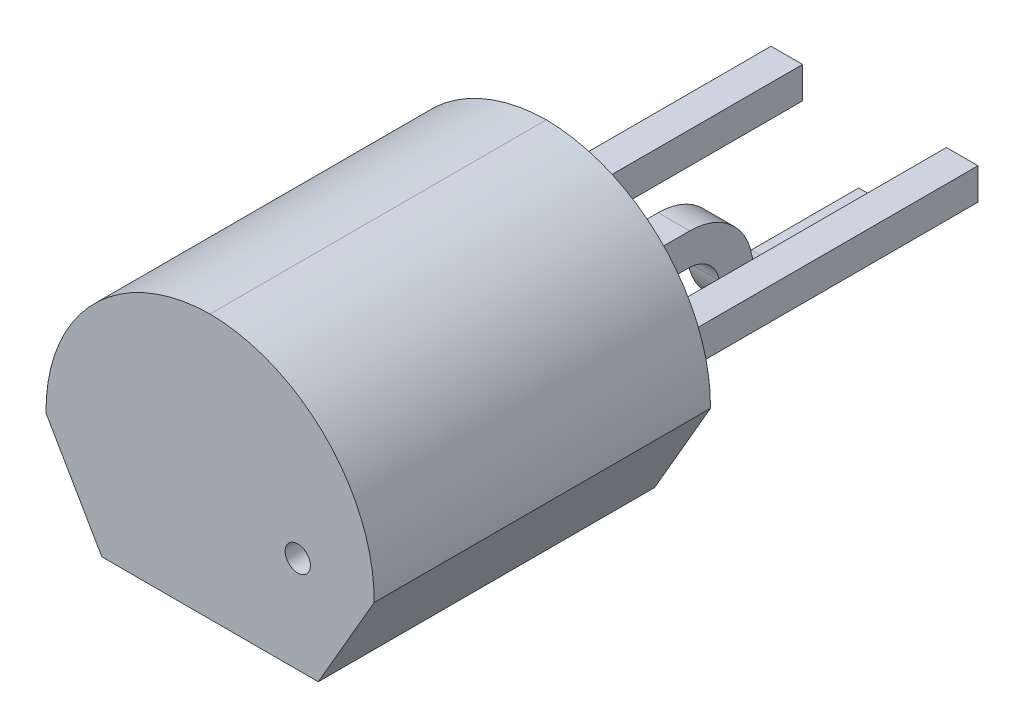
ISO-10303-21;
HEADER;
FILE_DESCRIPTION(('STEP AP214'),'2;1');
FILE_NAME('part.step','',(''),(''),'','','');
FILE_SCHEMA(('AUTOMOTIVE_DESIGN { 1 0 10303 214 1 1 1 1 }'));
ENDSEC;
DATA;
#1=APPLICATION_CONTEXT('core data for automotive mechanical design processes');
#2=APPLICATION_PROTOCOL_DEFINITION('international standard','automotive_design',2000,#1);
#3=PRODUCT_CONTEXT('',#1,'mechanical');
#4=PRODUCT('Part','Part','',(#3));
#5=PRODUCT_RELATED_PRODUCT_CATEGORY('part','',(#4));
#6=PRODUCT_DEFINITION_FORMATION('','',#4);
#7=PRODUCT_DEFINITION_CONTEXT('part definition',#1,'design');
#8=PRODUCT_DEFINITION('design','',#6,#7);
#9=PRODUCT_DEFINITION_SHAPE('','',#8);
#10=(LENGTH_UNIT() NAMED_UNIT(*) SI_UNIT(.MILLI.,.METRE.));
#11=(NAMED_UNIT(*) PLANE_ANGLE_UNIT() SI_UNIT($,.RADIAN.));
#12=(NAMED_UNIT(*) SI_UNIT($,.STERADIAN.) SOLID_ANGLE_UNIT());
#13=UNCERTAINTY_MEASURE_WITH_UNIT(LENGTH_MEASURE(1.E-05),#10,'distance_accuracy_value','');
#14=(GEOMETRIC_REPRESENTATION_CONTEXT(3) GLOBAL_UNCERTAINTY_ASSIGNED_CONTEXT((#13)) GLOBAL_UNIT_ASSIGNED_CONTEXT((#10,
#11,#12)) REPRESENTATION_CONTEXT('',''));
#15=CARTESIAN_POINT('',(0.,0.,0.));
#16=DIRECTION('',(0.,0.,1.));
#17=DIRECTION('',(1.,0.,0.));
#18=AXIS2_PLACEMENT_3D('',#15,#16,#17);
#19=CARTESIAN_POINT('',(2.53,0.25,2.54));
#20=DIRECTION('',(1.,0.,0.));
#21=DIRECTION('',(0.,0.,-1.));
#22=AXIS2_PLACEMENT_3D('',#19,#20,#21);
#23=PLANE('',#22);
#24=DIRECTION('',(0.,1.,0.));
#25=VECTOR('',#24,1.);
#26=CARTESIAN_POINT('',(2.53,-0.25,-2.66));
#27=LINE('',#26,#25);
#28=CARTESIAN_POINT('',(2.53,-0.25,-2.66));
#29=VERTEX_POINT('',#28);
#30=CARTESIAN_POINT('',(2.53,0.25,-2.66));
#31=VERTEX_POINT('',#30);
#32=EDGE_CURVE('E46',#29,#31,#27,.T.);
#33=ORIENTED_EDGE('',*,*,#32,.F.);
#34=DIRECTION('',(0.,0.,-1.));
#35=VECTOR('',#34,1.);
#36=CARTESIAN_POINT('',(2.53,-0.25,2.54));
#37=LINE('',#36,#35);
#38=CARTESIAN_POINT('',(2.53,-0.25,2.54));
#39=VERTEX_POINT('',#38);
#40=EDGE_CURVE('E196',#39,#29,#37,.T.);
#41=ORIENTED_EDGE('',*,*,#40,.F.);
#42=DIRECTION('',(0.,-1.,0.));
#43=VECTOR('',#42,1.);
#44=CARTESIAN_POINT('',(2.53,0.25,2.54));
#45=LINE('',#44,#43);
#46=CARTESIAN_POINT('',(2.53,0.25,2.54));
#47=VERTEX_POINT('',#46);
#48=EDGE_CURVE('E381',#47,#39,#45,.T.);
#49=ORIENTED_EDGE('',*,*,#48,.F.);
#50=DIRECTION('',(0.,0.,-1.));
#51=VECTOR('',#50,1.);
#52=CARTESIAN_POINT('',(2.53,0.25,2.54));
#53=LINE('',#52,#51);
#54=EDGE_CURVE('E199',#47,#31,#53,.T.);
#55=ORIENTED_EDGE('',*,*,#54,.T.);
#56=EDGE_LOOP('',(#33,#41,#49,#55));
#57=FACE_BOUND('',#56,.T.);
#58=ADVANCED_FACE('F31',(#57),#23,.F.);
#59=CARTESIAN_POINT('',(2.53,-0.25,2.54));
#60=DIRECTION('',(0.,1.,0.));
#61=DIRECTION('',(-1.,0.,0.));
#62=AXIS2_PLACEMENT_3D('',#59,#60,#61);
#63=PLANE('',#62);
#64=DIRECTION('',(-1.,0.,0.));
#65=VECTOR('',#64,1.);
#66=CARTESIAN_POINT('',(3.03,-0.25,-2.66));
#67=LINE('',#66,#65);
#68=CARTESIAN_POINT('',(3.03,-0.25,-2.66));
#69=VERTEX_POINT('',#68);
#70=EDGE_CURVE('E184',#69,#29,#67,.T.);
#71=ORIENTED_EDGE('',*,*,#70,.F.);
#72=DIRECTION('',(0.,0.,-1.));
#73=VECTOR('',#72,1.);
#74=CARTESIAN_POINT('',(3.03,-0.25,2.54));
#75=LINE('',#74,#73);
#76=CARTESIAN_POINT('',(3.03,-0.25,2.54));
#77=VERTEX_POINT('',#76);
#78=EDGE_CURVE('E206',#77,#69,#75,.T.);
#79=ORIENTED_EDGE('',*,*,#78,.F.);
#80=DIRECTION('',(1.,0.,0.));
#81=VECTOR('',#80,1.);
#82=CARTESIAN_POINT('',(2.53,-0.25,2.54));
#83=LINE('',#82,#81);
#84=EDGE_CURVE('E204',#39,#77,#83,.T.);
#85=ORIENTED_EDGE('',*,*,#84,.F.);
#86=ORIENTED_EDGE('',*,*,#40,.T.);
#87=EDGE_LOOP('',(#71,#79,#85,#86));
#88=FACE_BOUND('',#87,.T.);
#89=ADVANCED_FACE('F202',(#88),#63,.F.);
#90=CARTESIAN_POINT('',(3.03,0.25,2.54));
#91=DIRECTION('',(-1.,0.,0.));
#92=DIRECTION('',(0.,-1.,0.));
#93=AXIS2_PLACEMENT_3D('',#90,#91,#92);
#94=PLANE('',#93);
#95=DIRECTION('',(0.,-1.,0.));
#96=VECTOR('',#95,1.);
#97=CARTESIAN_POINT('',(3.03,0.25,-2.66));
#98=LINE('',#97,#96);
#99=CARTESIAN_POINT('',(3.03,0.25,-2.66));
#100=VERTEX_POINT('',#99);
#101=EDGE_CURVE('E187',#100,#69,#98,.T.);
#102=ORIENTED_EDGE('',*,*,#101,.F.);
#103=DIRECTION('',(0.,0.,-1.));
#104=VECTOR('',#103,1.);
#105=CARTESIAN_POINT('',(3.03,0.25,2.54));
#106=LINE('',#105,#104);
#107=CARTESIAN_POINT('',(3.03,0.25,2.54));
#108=VERTEX_POINT('',#107);
#109=EDGE_CURVE('E211',#108,#100,#106,.T.);
#110=ORIENTED_EDGE('',*,*,#109,.F.);
#111=DIRECTION('',(0.,1.,0.));
#112=VECTOR('',#111,1.);
#113=CARTESIAN_POINT('',(3.03,0.25,2.54));
#114=LINE('',#113,#112);
#115=EDGE_CURVE('E386',#77,#108,#114,.T.);
#116=ORIENTED_EDGE('',*,*,#115,.F.);
#117=ORIENTED_EDGE('',*,*,#78,.T.);
#118=EDGE_LOOP('',(#102,#110,#116,#117));
#119=FACE_BOUND('',#118,.T.);
#120=ADVANCED_FACE('F398',(#119),#94,.F.);
#121=CARTESIAN_POINT('',(2.53,0.25,2.54));
#122=DIRECTION('',(0.,-1.,0.));
#123=DIRECTION('',(1.,0.,0.));
#124=AXIS2_PLACEMENT_3D('',#121,#122,#123);
#125=PLANE('',#124);
#126=DIRECTION('',(1.,0.,0.));
#127=VECTOR('',#126,1.);
#128=CARTESIAN_POINT('',(2.53,0.25,-2.66));
#129=LINE('',#128,#127);
#130=EDGE_CURVE('E200',#31,#100,#129,.T.);
#131=ORIENTED_EDGE('',*,*,#130,.F.);
#132=ORIENTED_EDGE('',*,*,#54,.F.);
#133=DIRECTION('',(-1.,0.,0.));
#134=VECTOR('',#133,1.);
#135=CARTESIAN_POINT('',(2.53,0.25,2.54));
#136=LINE('',#135,#134);
#137=EDGE_CURVE('E389',#108,#47,#136,.T.);
#138=ORIENTED_EDGE('',*,*,#137,.F.);
#139=ORIENTED_EDGE('',*,*,#109,.T.);
#140=EDGE_LOOP('',(#131,#132,#138,#139));
#141=FACE_BOUND('',#140,.T.);
#142=ADVANCED_FACE('F395',(#141),#125,.F.);
#143=CARTESIAN_POINT('',(-0.25,0.25,2.54));
#144=DIRECTION('',(1.,0.,0.));
#145=DIRECTION('',(0.,1.,0.));
#146=AXIS2_PLACEMENT_3D('',#143,#144,#145);
#147=PLANE('',#146);
#148=DIRECTION('',(0.,1.,0.));
#149=VECTOR('',#148,1.);
#150=CARTESIAN_POINT('',(-0.25,-0.25,-2.66));
#151=LINE('',#150,#149);
#152=CARTESIAN_POINT('',(-0.25,-0.25,-2.66));
#153=VERTEX_POINT('',#152);
#154=CARTESIAN_POINT('',(-0.25,0.25,-2.66));
#155=VERTEX_POINT('',#154);
#156=EDGE_CURVE('E54',#153,#155,#151,.T.);
#157=ORIENTED_EDGE('',*,*,#156,.F.);
#158=DIRECTION('',(0.,0.,-1.));
#159=VECTOR('',#158,1.);
#160=CARTESIAN_POINT('',(-0.25,-0.25,2.54));
#161=LINE('',#160,#159);
#162=CARTESIAN_POINT('',(-0.25,-0.25,2.54));
#163=VERTEX_POINT('',#162);
#164=EDGE_CURVE('E256',#163,#153,#161,.T.);
#165=ORIENTED_EDGE('',*,*,#164,.F.);
#166=DIRECTION('',(0.,-1.,0.));
#167=VECTOR('',#166,1.);
#168=CARTESIAN_POINT('',(-0.25,0.25,2.54));
#169=LINE('',#168,#167);
#170=CARTESIAN_POINT('',(-0.25,0.25,2.54));
#171=VERTEX_POINT('',#170);
#172=EDGE_CURVE('E235',#171,#163,#169,.T.);
#173=ORIENTED_EDGE('',*,*,#172,.F.);
#174=DIRECTION('',(0.,0.,-1.));
#175=VECTOR('',#174,1.);
#176=CARTESIAN_POINT('',(-0.25,0.25,2.54));
#177=LINE('',#176,#175);
#178=EDGE_CURVE('E247',#171,#155,#177,.T.);
#179=ORIENTED_EDGE('',*,*,#178,.T.);
#180=EDGE_LOOP('',(#157,#165,#173,#179));
#181=FACE_BOUND('',#180,.T.);
#182=ADVANCED_FACE('F459',(#181),#147,.F.);
#183=CARTESIAN_POINT('',(-0.25,-0.25,2.54));
#184=DIRECTION('',(0.,1.,0.));
#185=DIRECTION('',(0.,0.,1.));
#186=AXIS2_PLACEMENT_3D('',#183,#184,#185);
#187=PLANE('',#186);
#188=DIRECTION('',(-1.,0.,0.));
#189=VECTOR('',#188,1.);
#190=CARTESIAN_POINT('',(0.25,-0.25,-2.66));
#191=LINE('',#190,#189);
#192=CARTESIAN_POINT('',(0.25,-0.25,-2.66));
#193=VERTEX_POINT('',#192);
#194=EDGE_CURVE('E399',#193,#153,#191,.T.);
#195=ORIENTED_EDGE('',*,*,#194,.F.);
#196=DIRECTION('',(0.,0.,-1.));
#197=VECTOR('',#196,1.);
#198=CARTESIAN_POINT('',(0.25,-0.25,2.54));
#199=LINE('',#198,#197);
#200=CARTESIAN_POINT('',(0.25,-0.25,2.54));
#201=VERTEX_POINT('',#200);
#202=EDGE_CURVE('E253',#201,#193,#199,.T.);
#203=ORIENTED_EDGE('',*,*,#202,.F.);
#204=DIRECTION('',(1.,0.,0.));
#205=VECTOR('',#204,1.);
#206=CARTESIAN_POINT('',(-0.25,-0.25,2.54));
#207=LINE('',#206,#205);
#208=EDGE_CURVE('E238',#163,#201,#207,.T.);
#209=ORIENTED_EDGE('',*,*,#208,.F.);
#210=ORIENTED_EDGE('',*,*,#164,.T.);
#211=EDGE_LOOP('',(#195,#203,#209,#210));
#212=FACE_BOUND('',#211,.T.);
#213=ADVANCED_FACE('F455',(#212),#187,.F.);
#214=CARTESIAN_POINT('',(0.25,0.25,2.54));
#215=DIRECTION('',(-1.,0.,0.));
#216=DIRECTION('',(0.,-1.,0.));
#217=AXIS2_PLACEMENT_3D('',#214,#215,#216);
#218=PLANE('',#217);
#219=DIRECTION('',(0.,-1.,0.));
#220=VECTOR('',#219,1.);
#221=CARTESIAN_POINT('',(0.25,0.25,-2.66));
#222=LINE('',#221,#220);
#223=CARTESIAN_POINT('',(0.25,0.25,-2.66));
#224=VERTEX_POINT('',#223);
#225=EDGE_CURVE('E407',#224,#193,#222,.T.);
#226=ORIENTED_EDGE('',*,*,#225,.F.);
#227=DIRECTION('',(0.,0.,-1.));
#228=VECTOR('',#227,1.);
#229=CARTESIAN_POINT('',(0.25,0.25,2.54));
#230=LINE('',#229,#228);
#231=CARTESIAN_POINT('',(0.25,0.25,2.54));
#232=VERTEX_POINT('',#231);
#233=EDGE_CURVE('E250',#232,#224,#230,.T.);
#234=ORIENTED_EDGE('',*,*,#233,.F.);
#235=DIRECTION('',(0.,1.,0.));
#236=VECTOR('',#235,1.);
#237=CARTESIAN_POINT('',(0.25,0.25,2.54));
#238=LINE('',#237,#236);
#239=EDGE_CURVE('E241',#201,#232,#238,.T.);
#240=ORIENTED_EDGE('',*,*,#239,.F.);
#241=ORIENTED_EDGE('',*,*,#202,.T.);
#242=EDGE_LOOP('',(#226,#234,#240,#241));
#243=FACE_BOUND('',#242,.T.);
#244=ADVANCED_FACE('F451',(#243),#218,.F.);
#245=CARTESIAN_POINT('',(-0.25,0.25,2.54));
#246=DIRECTION('',(0.,-1.,0.));
#247=DIRECTION('',(0.,0.,-1.));
#248=AXIS2_PLACEMENT_3D('',#245,#246,#247);
#249=PLANE('',#248);
#250=DIRECTION('',(1.,0.,0.));
#251=VECTOR('',#250,1.);
#252=CARTESIAN_POINT('',(-0.25,0.25,-2.66));
#253=LINE('',#252,#251);
#254=EDGE_CURVE('E405',#155,#224,#253,.T.);
#255=ORIENTED_EDGE('',*,*,#254,.F.);
#256=ORIENTED_EDGE('',*,*,#178,.F.);
#257=DIRECTION('',(-1.,0.,0.));
#258=VECTOR('',#257,1.);
#259=CARTESIAN_POINT('',(-0.25,0.25,2.54));
#260=LINE('',#259,#258);
#261=EDGE_CURVE('E244',#232,#171,#260,.T.);
#262=ORIENTED_EDGE('',*,*,#261,.F.);
#263=ORIENTED_EDGE('',*,*,#233,.T.);
#264=EDGE_LOOP('',(#255,#256,#262,#263));
#265=FACE_BOUND('',#264,.T.);
#266=ADVANCED_FACE('F448',(#265),#249,.F.);
#267=CARTESIAN_POINT('',(1.14,0.25,2.54));
#268=DIRECTION('',(1.,0.,0.));
#269=DIRECTION('',(0.,0.,-1.));
#270=AXIS2_PLACEMENT_3D('',#267,#268,#269);
#271=PLANE('',#270);
#272=DIRECTION('',(0.,1.,0.));
#273=VECTOR('',#272,1.);
#274=CARTESIAN_POINT('',(1.14,-1.5,-2.66));
#275=LINE('',#274,#273);
#276=CARTESIAN_POINT('',(1.14,-1.5,-2.66));
#277=VERTEX_POINT('',#276);
#278=CARTESIAN_POINT('',(1.14,-1.,-2.66));
#279=VERTEX_POINT('',#278);
#280=EDGE_CURVE('E411',#277,#279,#275,.T.);
#281=ORIENTED_EDGE('',*,*,#280,.F.);
#282=DIRECTION('',(0.,0.,1.));
#283=VECTOR('',#282,1.);
#284=CARTESIAN_POINT('',(1.14,-1.5,-10.16));
#285=LINE('',#284,#283);
#286=CARTESIAN_POINT('',(1.14,-1.5,-0.939019945774904));
#287=VERTEX_POINT('',#286);
#288=EDGE_CURVE('E356',#277,#287,#285,.T.);
#289=ORIENTED_EDGE('',*,*,#288,.T.);
#290=CARTESIAN_POINT('',(1.14,-0.5,-0.939019945774904));
#291=DIRECTION('',(1.,0.,0.));
#292=DIRECTION('',(0.,0.,-1.));
#293=AXIS2_PLACEMENT_3D('',#290,#291,#292);
#294=CIRCLE('',#293,1.);
#295=CARTESIAN_POINT('',(1.14,-0.666666666666667,0.0469933514083655));
#296=VERTEX_POINT('',#295);
#297=EDGE_CURVE('E307',#287,#296,#294,.F.);
#298=ORIENTED_EDGE('',*,*,#297,.T.);
#299=CARTESIAN_POINT('',(1.14,-0.75,0.54));
#300=DIRECTION('',(1.,0.,0.));
#301=DIRECTION('',(0.,0.,-1.));
#302=AXIS2_PLACEMENT_3D('',#299,#300,#301);
#303=CIRCLE('',#302,0.5);
#304=CARTESIAN_POINT('',(1.14,-0.25,0.54));
#305=VERTEX_POINT('',#304);
#306=EDGE_CURVE('E302',#296,#305,#303,.T.);
#307=ORIENTED_EDGE('',*,*,#306,.T.);
#308=DIRECTION('',(0.,0.,-1.));
#309=VECTOR('',#308,1.);
#310=CARTESIAN_POINT('',(1.14,-0.25,2.54));
#311=LINE('',#310,#309);
#312=CARTESIAN_POINT('',(1.14,-0.25,2.54));
#313=VERTEX_POINT('',#312);
#314=EDGE_CURVE('E232',#313,#305,#311,.T.);
#315=ORIENTED_EDGE('',*,*,#314,.F.);
#316=DIRECTION('',(0.,-1.,0.));
#317=VECTOR('',#316,1.);
#318=CARTESIAN_POINT('',(1.14,0.25,2.54));
#319=LINE('',#318,#317);
#320=CARTESIAN_POINT('',(1.14,0.25,2.54));
#321=VERTEX_POINT('',#320);
#322=EDGE_CURVE('E205',#321,#313,#319,.T.);
#323=ORIENTED_EDGE('',*,*,#322,.F.);
#324=DIRECTION('',(0.,0.,-1.));
#325=VECTOR('',#324,1.);
#326=CARTESIAN_POINT('',(1.14,0.25,2.54));
#327=LINE('',#326,#325);
#328=CARTESIAN_POINT('',(1.14,0.25,0.519019945774905));
#329=VERTEX_POINT('',#328);
#330=EDGE_CURVE('E223',#321,#329,#327,.T.);
#331=ORIENTED_EDGE('',*,*,#330,.T.);
#332=CARTESIAN_POINT('',(1.14,-0.75,0.519019945774905));
#333=DIRECTION('',(1.,0.,0.));
#334=DIRECTION('',(0.,0.,-1.));
#335=AXIS2_PLACEMENT_3D('',#332,#333,#334);
#336=CIRCLE('',#335,1.);
#337=CARTESIAN_POINT('',(1.14,-0.583333333333333,-0.466993351408365));
#338=VERTEX_POINT('',#337);
#339=EDGE_CURVE('E309',#329,#338,#336,.F.);
#340=ORIENTED_EDGE('',*,*,#339,.T.);
#341=CARTESIAN_POINT('',(1.14,-0.5,-0.96));
#342=DIRECTION('',(1.,0.,0.));
#343=DIRECTION('',(0.,0.,-1.));
#344=AXIS2_PLACEMENT_3D('',#341,#342,#343);
#345=CIRCLE('',#344,0.5);
#346=CARTESIAN_POINT('',(1.14,-1.,-0.96));
#347=VERTEX_POINT('',#346);
#348=EDGE_CURVE('E346',#338,#347,#345,.T.);
#349=ORIENTED_EDGE('',*,*,#348,.T.);
#350=DIRECTION('',(0.,0.,-1.));
#351=VECTOR('',#350,1.);
#352=CARTESIAN_POINT('',(1.14,-1.,2.54));
#353=LINE('',#352,#351);
#354=EDGE_CURVE('E357',#347,#279,#353,.T.);
#355=ORIENTED_EDGE('',*,*,#354,.T.);
#356=EDGE_LOOP('',(#281,#289,#298,#307,#315,#323,#331,#340,#349,#355));
#357=FACE_BOUND('',#356,.T.);
#358=ADVANCED_FACE('F335',(#357),#271,.F.);
#359=CARTESIAN_POINT('',(1.64,0.25,2.54));
#360=DIRECTION('',(-1.,0.,0.));
#361=DIRECTION('',(0.,0.,1.));
#362=AXIS2_PLACEMENT_3D('',#359,#360,#361);
#363=PLANE('',#362);
#364=DIRECTION('',(0.,-1.,0.));
#365=VECTOR('',#364,1.);
#366=CARTESIAN_POINT('',(1.64,-1.,-2.66));
#367=LINE('',#366,#365);
#368=CARTESIAN_POINT('',(1.64,-1.,-2.66));
#369=VERTEX_POINT('',#368);
#370=CARTESIAN_POINT('',(1.64,-1.5,-2.66));
#371=VERTEX_POINT('',#370);
#372=EDGE_CURVE('E365',#369,#371,#367,.T.);
#373=ORIENTED_EDGE('',*,*,#372,.F.);
#374=DIRECTION('',(0.,0.,-1.));
#375=VECTOR('',#374,1.);
#376=CARTESIAN_POINT('',(1.64,-1.,-2.46));
#377=LINE('',#376,#375);
#378=CARTESIAN_POINT('',(1.64,-1.,-0.96));
#379=VERTEX_POINT('',#378);
#380=EDGE_CURVE('E364',#379,#369,#377,.T.);
#381=ORIENTED_EDGE('',*,*,#380,.F.);
#382=CARTESIAN_POINT('',(1.64,-0.5,-0.96));
#383=DIRECTION('',(1.,0.,0.));
#384=DIRECTION('',(0.,0.,1.));
#385=AXIS2_PLACEMENT_3D('',#382,#383,#384);
#386=CIRCLE('',#385,0.5);
#387=CARTESIAN_POINT('',(1.64,-0.583333333333333,-0.466993351408365));
#388=VERTEX_POINT('',#387);
#389=EDGE_CURVE('E362',#388,#379,#386,.T.);
#390=ORIENTED_EDGE('',*,*,#389,.F.);
#391=CARTESIAN_POINT('',(1.64,-0.75,0.519019945774905));
#392=DIRECTION('',(-1.,0.,0.));
#393=DIRECTION('',(0.,0.,1.));
#394=AXIS2_PLACEMENT_3D('',#391,#392,#393);
#395=CIRCLE('',#394,1.);
#396=CARTESIAN_POINT('',(1.64,0.25,0.519019945774905));
#397=VERTEX_POINT('',#396);
#398=EDGE_CURVE('E315',#388,#397,#395,.F.);
#399=ORIENTED_EDGE('',*,*,#398,.T.);
#400=DIRECTION('',(0.,0.,-1.));
#401=VECTOR('',#400,1.);
#402=CARTESIAN_POINT('',(1.64,0.25,2.54));
#403=LINE('',#402,#401);
#404=CARTESIAN_POINT('',(1.64,0.25,2.54));
#405=VERTEX_POINT('',#404);
#406=EDGE_CURVE('E226',#405,#397,#403,.T.);
#407=ORIENTED_EDGE('',*,*,#406,.F.);
#408=DIRECTION('',(0.,1.,0.));
#409=VECTOR('',#408,1.);
#410=CARTESIAN_POINT('',(1.64,0.25,2.54));
#411=LINE('',#410,#409);
#412=CARTESIAN_POINT('',(1.64,-0.25,2.54));
#413=VERTEX_POINT('',#412);
#414=EDGE_CURVE('E217',#413,#405,#411,.T.);
#415=ORIENTED_EDGE('',*,*,#414,.F.);
#416=DIRECTION('',(0.,0.,-1.));
#417=VECTOR('',#416,1.);
#418=CARTESIAN_POINT('',(1.64,-0.25,2.54));
#419=LINE('',#418,#417);
#420=CARTESIAN_POINT('',(1.64,-0.25,0.54));
#421=VERTEX_POINT('',#420);
#422=EDGE_CURVE('E229',#413,#421,#419,.T.);
#423=ORIENTED_EDGE('',*,*,#422,.T.);
#424=CARTESIAN_POINT('',(1.64,-0.75,0.54));
#425=DIRECTION('',(-1.,0.,0.));
#426=DIRECTION('',(0.,0.,1.));
#427=AXIS2_PLACEMENT_3D('',#424,#425,#426);
#428=CIRCLE('',#427,0.5);
#429=CARTESIAN_POINT('',(1.64,-0.666666666666667,0.0469933514083655));
#430=VERTEX_POINT('',#429);
#431=EDGE_CURVE('E299',#421,#430,#428,.T.);
#432=ORIENTED_EDGE('',*,*,#431,.T.);
#433=CARTESIAN_POINT('',(1.64,-0.5,-0.939019945774904));
#434=DIRECTION('',(-1.,0.,0.));
#435=DIRECTION('',(0.,0.,1.));
#436=AXIS2_PLACEMENT_3D('',#433,#434,#435);
#437=CIRCLE('',#436,1.);
#438=CARTESIAN_POINT('',(1.64,-1.5,-0.939019945774904));
#439=VERTEX_POINT('',#438);
#440=EDGE_CURVE('E313',#430,#439,#437,.F.);
#441=ORIENTED_EDGE('',*,*,#440,.T.);
#442=DIRECTION('',(0.,0.,-1.));
#443=VECTOR('',#442,1.);
#444=CARTESIAN_POINT('',(1.64,-1.5,0.0400000000000001));
#445=LINE('',#444,#443);
#446=EDGE_CURVE('E375',#439,#371,#445,.T.);
#447=ORIENTED_EDGE('',*,*,#446,.T.);
#448=EDGE_LOOP('',(#373,#381,#390,#399,#407,#415,#423,#432,#441,#447));
#449=FACE_BOUND('',#448,.T.);
#450=ADVANCED_FACE('F326',(#449),#363,.F.);
#451=CARTESIAN_POINT('',(1.14,-1.5,-10.16));
#452=DIRECTION('',(0.,1.,0.));
#453=DIRECTION('',(-1.,0.,0.));
#454=AXIS2_PLACEMENT_3D('',#451,#452,#453);
#455=PLANE('',#454);
#456=DIRECTION('',(-1.,0.,0.));
#457=VECTOR('',#456,1.);
#458=CARTESIAN_POINT('',(1.64,-1.5,-2.66));
#459=LINE('',#458,#457);
#460=EDGE_CURVE('E409',#371,#277,#459,.T.);
#461=ORIENTED_EDGE('',*,*,#460,.F.);
#462=ORIENTED_EDGE('',*,*,#446,.F.);
#463=DIRECTION('',(1.,0.,0.));
#464=VECTOR('',#463,1.);
#465=CARTESIAN_POINT('',(1.14,-1.5,-0.939019945774904));
#466=LINE('',#465,#464);
#467=EDGE_CURVE('E11',#439,#287,#466,.F.);
#468=ORIENTED_EDGE('',*,*,#467,.T.);
#469=ORIENTED_EDGE('',*,*,#288,.F.);
#470=EDGE_LOOP('',(#461,#462,#468,#469));
#471=FACE_BOUND('',#470,.T.);
#472=ADVANCED_FACE('F420',(#471),#455,.F.);
#473=CARTESIAN_POINT('',(0.64,-1.,-2.46));
#474=DIRECTION('',(0.,-1.,0.));
#475=DIRECTION('',(0.,0.,-1.));
#476=AXIS2_PLACEMENT_3D('',#473,#474,#475);
#477=PLANE('',#476);
#478=DIRECTION('',(1.,0.,0.));
#479=VECTOR('',#478,1.);
#480=CARTESIAN_POINT('',(1.14,-1.,-2.66));
#481=LINE('',#480,#479);
#482=EDGE_CURVE('E368',#279,#369,#481,.T.);
#483=ORIENTED_EDGE('',*,*,#482,.F.);
#484=ORIENTED_EDGE('',*,*,#354,.F.);
#485=DIRECTION('',(1.,0.,0.));
#486=VECTOR('',#485,1.);
#487=CARTESIAN_POINT('',(0.64,-1.,-0.96));
#488=LINE('',#487,#486);
#489=EDGE_CURVE('E355',#347,#379,#488,.T.);
#490=ORIENTED_EDGE('',*,*,#489,.T.);
#491=ORIENTED_EDGE('',*,*,#380,.T.);
#492=EDGE_LOOP('',(#483,#484,#490,#491));
#493=FACE_BOUND('',#492,.T.);
#494=ADVANCED_FACE('F417',(#493),#477,.F.);
#495=CARTESIAN_POINT('',(1.36000000000001,0.0299999999999823,2.54));
#496=DIRECTION('',(0.,0.,-1.));
#497=DIRECTION('',(-1.,0.,0.));
#498=AXIS2_PLACEMENT_3D('',#495,#496,#497);
#499=PLANE('',#498);
#500=DIRECTION('',(-1.,0.,0.));
#501=VECTOR('',#500,1.);
#502=CARTESIAN_POINT('',(1.14,0.25,2.54));
#503=LINE('',#502,#501);
#504=EDGE_CURVE('E220',#405,#321,#503,.T.);
#505=ORIENTED_EDGE('',*,*,#504,.T.);
#506=ORIENTED_EDGE('',*,*,#322,.T.);
#507=DIRECTION('',(1.,0.,0.));
#508=VECTOR('',#507,1.);
#509=CARTESIAN_POINT('',(1.14,-0.25,2.54));
#510=LINE('',#509,#508);
#511=EDGE_CURVE('E209',#313,#413,#510,.T.);
#512=ORIENTED_EDGE('',*,*,#511,.T.);
#513=ORIENTED_EDGE('',*,*,#414,.T.);
#514=EDGE_LOOP('',(#505,#506,#512,#513));
#515=FACE_BOUND('',#514,.T.);
#516=DIRECTION('',(0.500701704226237,-0.865619895441956,0.));
#517=VECTOR('',#516,1.);
#518=CARTESIAN_POINT('',(-1.21000000000002,0.,2.54));
#519=LINE('',#518,#517);
#520=CARTESIAN_POINT('',(-1.21000000000002,0.,2.54));
#521=VERTEX_POINT('',#520);
#522=CARTESIAN_POINT('',(-0.325,-1.53000000000002,2.54));
#523=VERTEX_POINT('',#522);
#524=EDGE_CURVE('E259',#521,#523,#519,.T.);
#525=ORIENTED_EDGE('',*,*,#524,.F.);
#526=CARTESIAN_POINT('',(1.41999999999998,0.0299999999999944,2.54));
#527=DIRECTION('',(0.,0.,1.));
#528=DIRECTION('',(-1.,0.,0.));
#529=AXIS2_PLACEMENT_3D('',#526,#527,#528);
#530=CIRCLE('',#529,2.63017109709616);
#531=CARTESIAN_POINT('',(1.38999999999999,2.66,2.54));
#532=VERTEX_POINT('',#531);
#533=EDGE_CURVE('E264',#532,#521,#530,.T.);
#534=ORIENTED_EDGE('',*,*,#533,.F.);
#535=CARTESIAN_POINT('',(1.36000000000001,0.0299999999999823,2.54));
#536=DIRECTION('',(0.,0.,1.));
#537=DIRECTION('',(-1.,0.,0.));
#538=AXIS2_PLACEMENT_3D('',#535,#536,#537);
#539=CIRCLE('',#538,2.63017109709617);
#540=CARTESIAN_POINT('',(3.99000000000002,0.,2.54));
#541=VERTEX_POINT('',#540);
#542=EDGE_CURVE('E279',#541,#532,#539,.T.);
#543=ORIENTED_EDGE('',*,*,#542,.F.);
#544=DIRECTION('',(0.500701704226238,0.865619895441955,0.));
#545=VECTOR('',#544,1.);
#546=CARTESIAN_POINT('',(3.99000000000002,0.,2.54));
#547=LINE('',#546,#545);
#548=CARTESIAN_POINT('',(3.105,-1.53000000000001,2.54));
#549=VERTEX_POINT('',#548);
#550=EDGE_CURVE('E277',#549,#541,#547,.T.);
#551=ORIENTED_EDGE('',*,*,#550,.F.);
#552=DIRECTION('',(1.,0.,0.));
#553=VECTOR('',#552,1.);
#554=CARTESIAN_POINT('',(-0.325,-1.53000000000002,2.54));
#555=LINE('',#554,#553);
#556=EDGE_CURVE('E275',#523,#549,#555,.T.);
#557=ORIENTED_EDGE('',*,*,#556,.F.);
#558=EDGE_LOOP('',(#525,#534,#543,#551,#557));
#559=FACE_BOUND('',#558,.T.);
#560=ORIENTED_EDGE('',*,*,#261,.T.);
#561=ORIENTED_EDGE('',*,*,#172,.T.);
#562=ORIENTED_EDGE('',*,*,#208,.T.);
#563=ORIENTED_EDGE('',*,*,#239,.T.);
#564=EDGE_LOOP('',(#560,#561,#562,#563));
#565=FACE_BOUND('',#564,.T.);
#566=ORIENTED_EDGE('',*,*,#137,.T.);
#567=ORIENTED_EDGE('',*,*,#48,.T.);
#568=ORIENTED_EDGE('',*,*,#84,.T.);
#569=ORIENTED_EDGE('',*,*,#115,.T.);
#570=EDGE_LOOP('',(#566,#567,#568,#569));
#571=FACE_BOUND('',#570,.T.);
#572=ADVANCED_FACE('F338',(#515,#559,#565,#571),#499,.T.);
#573=CARTESIAN_POINT('',(-1.21000000000002,0.,7.87));
#574=DIRECTION('',(0.865619895441956,0.500701704226236,0.));
#575=DIRECTION('',(-0.500701704226237,0.865619895441956,0.));
#576=AXIS2_PLACEMENT_3D('',#573,#574,#575);
#577=PLANE('',#576);
#578=ORIENTED_EDGE('',*,*,#524,.T.);
#579=DIRECTION('',(0.,0.,-1.));
#580=VECTOR('',#579,1.);
#581=CARTESIAN_POINT('',(-0.325,-1.53000000000002,7.87));
#582=LINE('',#581,#580);
#583=CARTESIAN_POINT('',(-0.325,-1.53000000000002,7.87));
#584=VERTEX_POINT('',#583);
#585=EDGE_CURVE('E293',#584,#523,#582,.T.);
#586=ORIENTED_EDGE('',*,*,#585,.F.);
#587=DIRECTION('',(0.500701704226237,-0.865619895441956,0.));
#588=VECTOR('',#587,1.);
#589=CARTESIAN_POINT('',(-1.21000000000002,0.,7.87));
#590=LINE('',#589,#588);
#591=CARTESIAN_POINT('',(-1.21000000000002,0.,7.87));
#592=VERTEX_POINT('',#591);
#593=EDGE_CURVE('E260',#592,#584,#590,.T.);
#594=ORIENTED_EDGE('',*,*,#593,.F.);
#595=DIRECTION('',(0.,0.,-1.));
#596=VECTOR('',#595,1.);
#597=CARTESIAN_POINT('',(-1.21000000000002,0.,7.87));
#598=LINE('',#597,#596);
#599=EDGE_CURVE('E272',#592,#521,#598,.T.);
#600=ORIENTED_EDGE('',*,*,#599,.T.);
#601=EDGE_LOOP('',(#578,#586,#594,#600));
#602=FACE_BOUND('',#601,.T.);
#603=ADVANCED_FACE('F470',(#602),#577,.F.);
#604=CARTESIAN_POINT('',(-0.325,-1.53000000000002,7.87));
#605=DIRECTION('',(0.,1.,0.));
#606=DIRECTION('',(-1.,0.,0.));
#607=AXIS2_PLACEMENT_3D('',#604,#605,#606);
#608=PLANE('',#607);
#609=ORIENTED_EDGE('',*,*,#556,.T.);
#610=DIRECTION('',(0.,0.,-1.));
#611=VECTOR('',#610,1.);
#612=CARTESIAN_POINT('',(3.105,-1.53000000000001,7.87));
#613=LINE('',#612,#611);
#614=CARTESIAN_POINT('',(3.105,-1.53000000000001,7.87));
#615=VERTEX_POINT('',#614);
#616=EDGE_CURVE('E290',#615,#549,#613,.T.);
#617=ORIENTED_EDGE('',*,*,#616,.F.);
#618=DIRECTION('',(1.,0.,0.));
#619=VECTOR('',#618,1.);
#620=CARTESIAN_POINT('',(-0.325,-1.53000000000002,7.87));
#621=LINE('',#620,#619);
#622=EDGE_CURVE('E263',#584,#615,#621,.T.);
#623=ORIENTED_EDGE('',*,*,#622,.F.);
#624=ORIENTED_EDGE('',*,*,#585,.T.);
#625=EDGE_LOOP('',(#609,#617,#623,#624));
#626=FACE_BOUND('',#625,.T.);
#627=ADVANCED_FACE('F481',(#626),#608,.F.);
#628=CARTESIAN_POINT('',(3.99000000000002,0.,7.87));
#629=DIRECTION('',(-0.865619895441955,0.500701704226238,0.));
#630=DIRECTION('',(-0.500701704226238,-0.865619895441955,0.));
#631=AXIS2_PLACEMENT_3D('',#628,#629,#630);
#632=PLANE('',#631);
#633=ORIENTED_EDGE('',*,*,#550,.T.);
#634=DIRECTION('',(0.,0.,-1.));
#635=VECTOR('',#634,1.);
#636=CARTESIAN_POINT('',(3.99000000000002,0.,7.87));
#637=LINE('',#636,#635);
#638=CARTESIAN_POINT('',(3.99000000000002,0.,7.87));
#639=VERTEX_POINT('',#638);
#640=EDGE_CURVE('E287',#639,#541,#637,.T.);
#641=ORIENTED_EDGE('',*,*,#640,.F.);
#642=DIRECTION('',(0.500701704226238,0.865619895441955,0.));
#643=VECTOR('',#642,1.);
#644=CARTESIAN_POINT('',(3.99000000000002,0.,7.87));
#645=LINE('',#644,#643);
#646=EDGE_CURVE('E266',#615,#639,#645,.T.);
#647=ORIENTED_EDGE('',*,*,#646,.F.);
#648=ORIENTED_EDGE('',*,*,#616,.T.);
#649=EDGE_LOOP('',(#633,#641,#647,#648));
#650=FACE_BOUND('',#649,.T.);
#651=ADVANCED_FACE('F477',(#650),#632,.F.);
#652=CARTESIAN_POINT('',(1.36000000000001,0.0299999999999823,7.87));
#653=DIRECTION('',(0.,0.,-1.));
#654=DIRECTION('',(-1.,0.,0.));
#655=AXIS2_PLACEMENT_3D('',#652,#653,#654);
#656=CYLINDRICAL_SURFACE('',#655,2.63017109709617);
#657=ORIENTED_EDGE('',*,*,#542,.T.);
#658=DIRECTION('',(0.,0.,-1.));
#659=VECTOR('',#658,1.);
#660=CARTESIAN_POINT('',(1.38999999999999,2.66,7.87));
#661=LINE('',#660,#659);
#662=CARTESIAN_POINT('',(1.38999999999999,2.66,7.87));
#663=VERTEX_POINT('',#662);
#664=EDGE_CURVE('E284',#663,#532,#661,.T.);
#665=ORIENTED_EDGE('',*,*,#664,.F.);
#666=CARTESIAN_POINT('',(1.36000000000001,0.0299999999999823,7.87));
#667=DIRECTION('',(0.,0.,1.));
#668=DIRECTION('',(-1.,0.,0.));
#669=AXIS2_PLACEMENT_3D('',#666,#667,#668);
#670=CIRCLE('',#669,2.63017109709617);
#671=EDGE_CURVE('E268',#639,#663,#670,.T.);
#672=ORIENTED_EDGE('',*,*,#671,.F.);
#673=ORIENTED_EDGE('',*,*,#640,.T.);
#674=EDGE_LOOP('',(#657,#665,#672,#673));
#675=FACE_BOUND('',#674,.T.);
#676=ADVANCED_FACE('F473',(#675),#656,.T.);
#677=CARTESIAN_POINT('',(1.41999999999998,0.0299999999999944,7.87));
#678=DIRECTION('',(0.,0.,-1.));
#679=DIRECTION('',(-1.,0.,0.));
#680=AXIS2_PLACEMENT_3D('',#677,#678,#679);
#681=CYLINDRICAL_SURFACE('',#680,2.63017109709616);
#682=ORIENTED_EDGE('',*,*,#533,.T.);
#683=ORIENTED_EDGE('',*,*,#599,.F.);
#684=CARTESIAN_POINT('',(1.41999999999998,0.0299999999999944,7.87));
#685=DIRECTION('',(0.,0.,1.));
#686=DIRECTION('',(-1.,0.,0.));
#687=AXIS2_PLACEMENT_3D('',#684,#685,#686);
#688=CIRCLE('',#687,2.63017109709616);
#689=EDGE_CURVE('E270',#663,#592,#688,.T.);
#690=ORIENTED_EDGE('',*,*,#689,.F.);
#691=ORIENTED_EDGE('',*,*,#664,.T.);
#692=EDGE_LOOP('',(#682,#683,#690,#691));
#693=FACE_BOUND('',#692,.T.);
#694=ADVANCED_FACE('F466',(#693),#681,.T.);
#695=CARTESIAN_POINT('',(1.36000000000001,0.0299999999999823,7.87));
#696=DIRECTION('',(0.,0.,-1.));
#697=DIRECTION('',(-1.,0.,0.));
#698=AXIS2_PLACEMENT_3D('',#695,#696,#697);
#699=PLANE('',#698);
#700=CARTESIAN_POINT('',(2.77999999999999,0.,7.87));
#701=DIRECTION('',(0.,0.,1.));
#702=DIRECTION('',(-1.,0.,0.));
#703=AXIS2_PLACEMENT_3D('',#700,#701,#702);
#704=CIRCLE('',#703,0.2);
#705=CARTESIAN_POINT('',(2.57999999999999,0.,7.87));
#706=VERTEX_POINT('',#705);
#707=EDGE_CURVE('E377',#706,#706,#704,.T.);
#708=ORIENTED_EDGE('',*,*,#707,.F.);
#709=EDGE_LOOP('',(#708));
#710=FACE_BOUND('',#709,.T.);
#711=ORIENTED_EDGE('',*,*,#593,.T.);
#712=ORIENTED_EDGE('',*,*,#622,.T.);
#713=ORIENTED_EDGE('',*,*,#646,.T.);
#714=ORIENTED_EDGE('',*,*,#671,.T.);
#715=ORIENTED_EDGE('',*,*,#689,.T.);
#716=EDGE_LOOP('',(#711,#712,#713,#714,#715));
#717=FACE_BOUND('',#716,.T.);
#718=ADVANCED_FACE('F445',(#710,#717),#699,.F.);
#719=CARTESIAN_POINT('',(1.14,-0.25,2.54));
#720=DIRECTION('',(0.,1.,0.));
#721=DIRECTION('',(-1.,0.,0.));
#722=AXIS2_PLACEMENT_3D('',#719,#720,#721);
#723=PLANE('',#722);
#724=ORIENTED_EDGE('',*,*,#314,.T.);
#725=DIRECTION('',(1.,0.,0.));
#726=VECTOR('',#725,1.);
#727=CARTESIAN_POINT('',(1.14,-0.25,0.54));
#728=LINE('',#727,#726);
#729=EDGE_CURVE('E296',#305,#421,#728,.T.);
#730=ORIENTED_EDGE('',*,*,#729,.T.);
#731=ORIENTED_EDGE('',*,*,#422,.F.);
#732=ORIENTED_EDGE('',*,*,#511,.F.);
#733=EDGE_LOOP('',(#724,#730,#731,#732));
#734=FACE_BOUND('',#733,.T.);
#735=ADVANCED_FACE('F331',(#734),#723,.F.);
#736=CARTESIAN_POINT('',(1.14,0.25,2.54));
#737=DIRECTION('',(0.,-1.,0.));
#738=DIRECTION('',(1.,0.,0.));
#739=AXIS2_PLACEMENT_3D('',#736,#737,#738);
#740=PLANE('',#739);
#741=ORIENTED_EDGE('',*,*,#406,.T.);
#742=DIRECTION('',(1.,0.,0.));
#743=VECTOR('',#742,1.);
#744=CARTESIAN_POINT('',(1.14,0.25,0.519019945774905));
#745=LINE('',#744,#743);
#746=EDGE_CURVE('E304',#397,#329,#745,.F.);
#747=ORIENTED_EDGE('',*,*,#746,.T.);
#748=ORIENTED_EDGE('',*,*,#330,.F.);
#749=ORIENTED_EDGE('',*,*,#504,.F.);
#750=EDGE_LOOP('',(#741,#747,#748,#749));
#751=FACE_BOUND('',#750,.T.);
#752=ADVANCED_FACE('F342',(#751),#740,.F.);
#753=CARTESIAN_POINT('',(2.77999999999999,0.,7.37));
#754=DIRECTION('',(0.,0.,1.));
#755=DIRECTION('',(1.,0.,0.));
#756=AXIS2_PLACEMENT_3D('',#753,#754,#755);
#757=CYLINDRICAL_SURFACE('',#756,0.2);
#758=CARTESIAN_POINT('',(2.77999999999999,0.,7.37));
#759=DIRECTION('',(0.,0.,1.));
#760=DIRECTION('',(-1.,0.,0.));
#761=AXIS2_PLACEMENT_3D('',#758,#759,#760);
#762=CIRCLE('',#761,0.2);
#763=CARTESIAN_POINT('',(2.57999999999999,0.,7.37));
#764=VERTEX_POINT('',#763);
#765=EDGE_CURVE('E378',#764,#764,#762,.T.);
#766=ORIENTED_EDGE('',*,*,#765,.F.);
#767=EDGE_LOOP('',(#766));
#768=FACE_BOUND('',#767,.T.);
#769=ORIENTED_EDGE('',*,*,#707,.T.);
#770=EDGE_LOOP('',(#769));
#771=FACE_BOUND('',#770,.T.);
#772=ADVANCED_FACE('F440',(#768,#771),#757,.F.);
#773=CARTESIAN_POINT('',(2.77999999999999,0.,7.37));
#774=DIRECTION('',(0.,0.,-1.));
#775=DIRECTION('',(-1.,0.,0.));
#776=AXIS2_PLACEMENT_3D('',#773,#774,#775);
#777=PLANE('',#776);
#778=ORIENTED_EDGE('',*,*,#765,.T.);
#779=EDGE_LOOP('',(#778));
#780=FACE_BOUND('',#779,.T.);
#781=ADVANCED_FACE('F493',(#780),#777,.F.);
#782=CARTESIAN_POINT('',(0.64,-0.5,-0.96));
#783=DIRECTION('',(1.,0.,0.));
#784=DIRECTION('',(0.,0.,-1.));
#785=AXIS2_PLACEMENT_3D('',#782,#783,#784);
#786=CYLINDRICAL_SURFACE('',#785,0.5);
#787=ORIENTED_EDGE('',*,*,#348,.F.);
#788=DIRECTION('',(1.,0.,0.));
#789=VECTOR('',#788,1.);
#790=CARTESIAN_POINT('',(0.64,-0.583333333333333,-0.466993351408365));
#791=LINE('',#790,#789);
#792=EDGE_CURVE('E311',#338,#388,#791,.T.);
#793=ORIENTED_EDGE('',*,*,#792,.T.);
#794=ORIENTED_EDGE('',*,*,#389,.T.);
#795=ORIENTED_EDGE('',*,*,#489,.F.);
#796=EDGE_LOOP('',(#787,#793,#794,#795));
#797=FACE_BOUND('',#796,.T.);
#798=ADVANCED_FACE('F352',(#797),#786,.F.);
#799=CARTESIAN_POINT('',(1.14,-0.75,0.54));
#800=DIRECTION('',(1.,0.,0.));
#801=DIRECTION('',(0.,1.,0.));
#802=AXIS2_PLACEMENT_3D('',#799,#800,#801);
#803=CYLINDRICAL_SURFACE('',#802,0.5);
#804=ORIENTED_EDGE('',*,*,#306,.F.);
#805=DIRECTION('',(1.,0.,0.));
#806=VECTOR('',#805,1.);
#807=CARTESIAN_POINT('',(1.14,-0.666666666666667,0.0469933514083654));
#808=LINE('',#807,#806);
#809=EDGE_CURVE('E39',#296,#430,#808,.T.);
#810=ORIENTED_EDGE('',*,*,#809,.T.);
#811=ORIENTED_EDGE('',*,*,#431,.F.);
#812=ORIENTED_EDGE('',*,*,#729,.F.);
#813=EDGE_LOOP('',(#804,#810,#811,#812));
#814=FACE_BOUND('',#813,.T.);
#815=ADVANCED_FACE('F320',(#814),#803,.F.);
#816=CARTESIAN_POINT('',(0.64,-0.75,0.519019945774905));
#817=DIRECTION('',(1.,0.,0.));
#818=DIRECTION('',(0.,0.,-1.));
#819=AXIS2_PLACEMENT_3D('',#816,#817,#818);
#820=CYLINDRICAL_SURFACE('',#819,1.);
#821=ORIENTED_EDGE('',*,*,#398,.F.);
#822=ORIENTED_EDGE('',*,*,#792,.F.);
#823=ORIENTED_EDGE('',*,*,#339,.F.);
#824=ORIENTED_EDGE('',*,*,#746,.F.);
#825=EDGE_LOOP('',(#821,#822,#823,#824));
#826=FACE_BOUND('',#825,.T.);
#827=ADVANCED_FACE('F360',(#826),#820,.T.);
#828=CARTESIAN_POINT('',(1.14,-0.5,-0.939019945774904));
#829=DIRECTION('',(1.,0.,0.));
#830=DIRECTION('',(0.,1.,0.));
#831=AXIS2_PLACEMENT_3D('',#828,#829,#830);
#832=CYLINDRICAL_SURFACE('',#831,1.);
#833=ORIENTED_EDGE('',*,*,#297,.F.);
#834=ORIENTED_EDGE('',*,*,#467,.F.);
#835=ORIENTED_EDGE('',*,*,#440,.F.);
#836=ORIENTED_EDGE('',*,*,#809,.F.);
#837=EDGE_LOOP('',(#833,#834,#835,#836));
#838=FACE_BOUND('',#837,.T.);
#839=ADVANCED_FACE('F33',(#838),#832,.T.);
#840=CARTESIAN_POINT('',(1.14,-1.5,-2.66));
#841=DIRECTION('',(0.,0.,-1.));
#842=DIRECTION('',(-1.,0.,0.));
#843=AXIS2_PLACEMENT_3D('',#840,#841,#842);
#844=PLANE('',#843);
#845=CARTESIAN_POINT('',(1.39,-1.25,-2.66));
#846=DIRECTION('',(0.,0.,-1.));
#847=DIRECTION('',(-1.,0.,0.));
#848=AXIS2_PLACEMENT_3D('',#845,#846,#847);
#849=CIRCLE('',#848,0.124451117526822);
#850=CARTESIAN_POINT('',(1.26554888247318,-1.25,-2.66));
#851=VERTEX_POINT('',#850);
#852=EDGE_CURVE('E728',#851,#851,#849,.T.);
#853=ORIENTED_EDGE('',*,*,#852,.F.);
#854=EDGE_LOOP('',(#853));
#855=FACE_BOUND('',#854,.T.);
#856=ORIENTED_EDGE('',*,*,#460,.T.);
#857=ORIENTED_EDGE('',*,*,#280,.T.);
#858=ORIENTED_EDGE('',*,*,#482,.T.);
#859=ORIENTED_EDGE('',*,*,#372,.T.);
#860=EDGE_LOOP('',(#856,#857,#858,#859));
#861=FACE_BOUND('',#860,.T.);
#862=ADVANCED_FACE('F414',(#855,#861),#844,.T.);
#863=CARTESIAN_POINT('',(-0.25,-0.25,-2.66));
#864=DIRECTION('',(0.,0.,-1.));
#865=DIRECTION('',(-1.,0.,0.));
#866=AXIS2_PLACEMENT_3D('',#863,#864,#865);
#867=PLANE('',#866);
#868=ORIENTED_EDGE('',*,*,#194,.T.);
#869=ORIENTED_EDGE('',*,*,#156,.T.);
#870=ORIENTED_EDGE('',*,*,#254,.T.);
#871=ORIENTED_EDGE('',*,*,#225,.T.);
#872=EDGE_LOOP('',(#868,#869,#870,#871));
#873=FACE_BOUND('',#872,.T.);
#874=ADVANCED_FACE('F427',(#873),#867,.T.);
#875=CARTESIAN_POINT('',(2.53,-0.25,-2.66));
#876=DIRECTION('',(0.,0.,-1.));
#877=DIRECTION('',(-1.,0.,0.));
#878=AXIS2_PLACEMENT_3D('',#875,#876,#877);
#879=PLANE('',#878);
#880=ORIENTED_EDGE('',*,*,#70,.T.);
#881=ORIENTED_EDGE('',*,*,#32,.T.);
#882=ORIENTED_EDGE('',*,*,#130,.T.);
#883=ORIENTED_EDGE('',*,*,#101,.T.);
#884=EDGE_LOOP('',(#880,#881,#882,#883));
#885=FACE_BOUND('',#884,.T.);
#886=ADVANCED_FACE('F185',(#885),#879,.T.);
#887=CARTESIAN_POINT('',(1.39,-1.25,-1.66));
#888=DIRECTION('',(0.,0.,-1.));
#889=DIRECTION('',(-1.,0.,0.));
#890=AXIS2_PLACEMENT_3D('',#887,#888,#889);
#891=CYLINDRICAL_SURFACE('',#890,0.124451117526822);
#892=CARTESIAN_POINT('',(1.39,-1.25,-1.66));
#893=DIRECTION('',(0.,0.,-1.));
#894=DIRECTION('',(-1.,0.,0.));
#895=AXIS2_PLACEMENT_3D('',#892,#893,#894);
#896=CIRCLE('',#895,0.124451117526822);
#897=CARTESIAN_POINT('',(1.26554888247318,-1.25,-1.66));
#898=VERTEX_POINT('',#897);
#899=EDGE_CURVE('E191',#898,#898,#896,.T.);
#900=ORIENTED_EDGE('',*,*,#899,.F.);
#901=EDGE_LOOP('',(#900));
#902=FACE_BOUND('',#901,.T.);
#903=ORIENTED_EDGE('',*,*,#852,.T.);
#904=EDGE_LOOP('',(#903));
#905=FACE_BOUND('',#904,.T.);
#906=ADVANCED_FACE('F703',(#902,#905),#891,.F.);
#907=CARTESIAN_POINT('',(1.39,-1.25,-1.66));
#908=DIRECTION('',(0.,0.,-1.));
#909=DIRECTION('',(-1.,0.,0.));
#910=AXIS2_PLACEMENT_3D('',#907,#908,#909);
#911=PLANE('',#910);
#912=ORIENTED_EDGE('',*,*,#899,.T.);
#913=EDGE_LOOP('',(#912));
#914=FACE_BOUND('',#913,.T.);
#915=ADVANCED_FACE('F710',(#914),#911,.T.);
#916=CLOSED_SHELL('',(#58,#89,#120,#142,#182,#213,#244,#266,#358,#450,#472,#494,#572,#603,#627,
#651,#676,#694,#718,#735,#752,#772,#781,#798,#815,#827,#839,#862,#874,#886,#906,#915));
#917=MANIFOLD_SOLID_BREP('B2',#916);
#918=ADVANCED_BREP_SHAPE_REPRESENTATION('',(#18,#917),#14);
#919=SHAPE_DEFINITION_REPRESENTATION(#9,#918);
ENDSEC;
END-ISO-10303-21;
